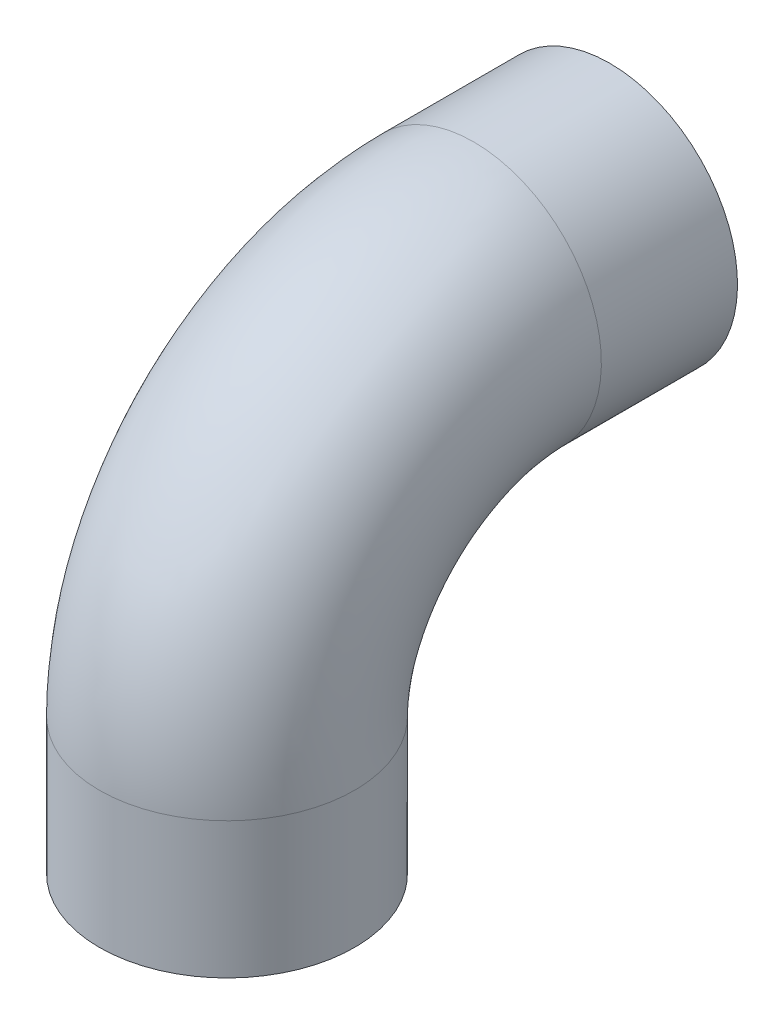
ISO-10303-21;
HEADER;
FILE_DESCRIPTION(('STEP AP214'),'2;1');
FILE_NAME('part.step','',(''),(''),'','','');
FILE_SCHEMA(('AUTOMOTIVE_DESIGN { 1 0 10303 214 1 1 1 1 }'));
ENDSEC;
DATA;
#1=APPLICATION_CONTEXT('core data for automotive mechanical design processes');
#2=APPLICATION_PROTOCOL_DEFINITION('international standard','automotive_design',2000,#1);
#3=PRODUCT_CONTEXT('',#1,'mechanical');
#4=PRODUCT('Part','Part','',(#3));
#5=PRODUCT_RELATED_PRODUCT_CATEGORY('part','',(#4));
#6=PRODUCT_DEFINITION_FORMATION('','',#4);
#7=PRODUCT_DEFINITION_CONTEXT('part definition',#1,'design');
#8=PRODUCT_DEFINITION('design','',#6,#7);
#9=PRODUCT_DEFINITION_SHAPE('','',#8);
#10=(LENGTH_UNIT() NAMED_UNIT(*) SI_UNIT(.MILLI.,.METRE.));
#11=(NAMED_UNIT(*) PLANE_ANGLE_UNIT() SI_UNIT($,.RADIAN.));
#12=(NAMED_UNIT(*) SI_UNIT($,.STERADIAN.) SOLID_ANGLE_UNIT());
#13=UNCERTAINTY_MEASURE_WITH_UNIT(LENGTH_MEASURE(1.E-05),#10,'distance_accuracy_value','');
#14=(GEOMETRIC_REPRESENTATION_CONTEXT(3) GLOBAL_UNCERTAINTY_ASSIGNED_CONTEXT((#13)) GLOBAL_UNIT_ASSIGNED_CONTEXT((#10,
#11,#12)) REPRESENTATION_CONTEXT('',''));
#15=CARTESIAN_POINT('',(0.,0.,0.));
#16=DIRECTION('',(0.,0.,1.));
#17=DIRECTION('',(1.,0.,0.));
#18=AXIS2_PLACEMENT_3D('',#15,#16,#17);
#19=CARTESIAN_POINT('',(0.,0.,0.));
#20=DIRECTION('',(0.,1.,0.));
#21=DIRECTION('',(0.,0.,1.));
#22=AXIS2_PLACEMENT_3D('',#19,#20,#21);
#23=CYLINDRICAL_SURFACE('',#22,14.2875);
#24=CARTESIAN_POINT('',(0.,15.24,0.));
#25=DIRECTION('',(0.,1.,0.));
#26=DIRECTION('',(0.,0.,1.));
#27=AXIS2_PLACEMENT_3D('',#24,#25,#26);
#28=CIRCLE('',#27,14.2875);
#29=CARTESIAN_POINT('',(0.,15.24,14.2875));
#30=VERTEX_POINT('',#29);
#31=EDGE_CURVE('E79',#30,#30,#28,.T.);
#32=ORIENTED_EDGE('',*,*,#31,.F.);
#33=EDGE_LOOP('',(#32));
#34=FACE_BOUND('',#33,.T.);
#35=CARTESIAN_POINT('',(0.,0.,0.));
#36=DIRECTION('',(0.,1.,0.));
#37=DIRECTION('',(0.,0.,1.));
#38=AXIS2_PLACEMENT_3D('',#35,#36,#37);
#39=CIRCLE('',#38,14.2875);
#40=CARTESIAN_POINT('',(0.,0.,14.2875));
#41=VERTEX_POINT('',#40);
#42=EDGE_CURVE('E48',#41,#41,#39,.T.);
#43=ORIENTED_EDGE('',*,*,#42,.T.);
#44=EDGE_LOOP('',(#43));
#45=FACE_BOUND('',#44,.T.);
#46=ADVANCED_FACE('F33',(#34,#45),#23,.T.);
#47=CARTESIAN_POINT('',(0.,15.24,-27.6225));
#48=DIRECTION('',(-1.,0.,0.));
#49=DIRECTION('',(0.,0.,1.));
#50=AXIS2_PLACEMENT_3D('',#47,#48,#49);
#51=TOROIDAL_SURFACE('',#50,27.6225,14.2875);
#52=CARTESIAN_POINT('',(0.,42.8625,-27.6225));
#53=DIRECTION('',(0.,0.,-1.));
#54=DIRECTION('',(0.,1.,0.));
#55=AXIS2_PLACEMENT_3D('',#52,#53,#54);
#56=CIRCLE('',#55,14.2875);
#57=CARTESIAN_POINT('',(0.,57.15,-27.6225));
#58=VERTEX_POINT('',#57);
#59=EDGE_CURVE('E37',#58,#58,#56,.T.);
#60=CARTESIAN_POINT('',(0.,15.24,-27.6225));
#61=DIRECTION('',(-1.,0.,0.));
#62=DIRECTION('',(0.,0.,1.));
#63=AXIS2_PLACEMENT_3D('',#60,#61,#62);
#64=CIRCLE('',#63,41.91);
#65=EDGE_CURVE('',#30,#58,#64,.T.);
#66=ORIENTED_EDGE('',*,*,#31,.T.);
#67=ORIENTED_EDGE('',*,*,#59,.F.);
#68=ORIENTED_EDGE('',*,*,#65,.T.);
#69=ORIENTED_EDGE('',*,*,#65,.F.);
#70=EDGE_LOOP('',(#66,#68,#67,#69));
#71=FACE_BOUND('',#70,.T.);
#72=ADVANCED_FACE('F87',(#71),#51,.T.);
#73=CARTESIAN_POINT('',(0.,42.8625,-27.6225));
#74=DIRECTION('',(0.,0.,-1.));
#75=DIRECTION('',(-1.,0.,0.));
#76=AXIS2_PLACEMENT_3D('',#73,#74,#75);
#77=CYLINDRICAL_SURFACE('',#76,14.2875);
#78=CARTESIAN_POINT('',(0.,42.8625,-42.8625));
#79=DIRECTION('',(0.,0.,-1.));
#80=DIRECTION('',(0.,1.,0.));
#81=AXIS2_PLACEMENT_3D('',#78,#79,#80);
#82=CIRCLE('',#81,14.2875);
#83=CARTESIAN_POINT('',(0.,57.15,-42.8625));
#84=VERTEX_POINT('',#83);
#85=EDGE_CURVE('E53',#84,#84,#82,.T.);
#86=ORIENTED_EDGE('',*,*,#85,.F.);
#87=EDGE_LOOP('',(#86));
#88=FACE_BOUND('',#87,.T.);
#89=ORIENTED_EDGE('',*,*,#59,.T.);
#90=EDGE_LOOP('',(#89));
#91=FACE_BOUND('',#90,.T.);
#92=ADVANCED_FACE('F35',(#88,#91),#77,.T.);
#93=CARTESIAN_POINT('',(0.,0.,0.));
#94=DIRECTION('',(0.,1.,0.));
#95=DIRECTION('',(0.,0.,1.));
#96=AXIS2_PLACEMENT_3D('',#93,#94,#95);
#97=PLANE('',#96);
#98=CARTESIAN_POINT('',(0.,0.,0.));
#99=DIRECTION('',(0.,1.,0.));
#100=DIRECTION('',(0.,0.,1.));
#101=AXIS2_PLACEMENT_3D('',#98,#99,#100);
#102=CIRCLE('',#101,10.668);
#103=CARTESIAN_POINT('',(0.,0.,10.668));
#104=VERTEX_POINT('',#103);
#105=EDGE_CURVE('E74',#104,#104,#102,.F.);
#106=ORIENTED_EDGE('',*,*,#105,.F.);
#107=EDGE_LOOP('',(#106));
#108=FACE_BOUND('',#107,.T.);
#109=ORIENTED_EDGE('',*,*,#42,.F.);
#110=EDGE_LOOP('',(#109));
#111=FACE_BOUND('',#110,.T.);
#112=ADVANCED_FACE('F93',(#108,#111),#97,.F.);
#113=CARTESIAN_POINT('',(0.,42.8625,-42.8625));
#114=DIRECTION('',(0.,0.,-1.));
#115=DIRECTION('',(0.,1.,0.));
#116=AXIS2_PLACEMENT_3D('',#113,#114,#115);
#117=PLANE('',#116);
#118=CARTESIAN_POINT('',(0.,42.8625,-42.8625));
#119=DIRECTION('',(0.,0.,-1.));
#120=DIRECTION('',(0.,1.,0.));
#121=AXIS2_PLACEMENT_3D('',#118,#119,#120);
#122=CIRCLE('',#121,10.668);
#123=CARTESIAN_POINT('',(0.,53.5305,-42.8625));
#124=VERTEX_POINT('',#123);
#125=EDGE_CURVE('E11',#124,#124,#122,.F.);
#126=ORIENTED_EDGE('',*,*,#125,.T.);
#127=EDGE_LOOP('',(#126));
#128=FACE_BOUND('',#127,.T.);
#129=ORIENTED_EDGE('',*,*,#85,.T.);
#130=EDGE_LOOP('',(#129));
#131=FACE_BOUND('',#130,.T.);
#132=ADVANCED_FACE('F60',(#128,#131),#117,.T.);
#133=CARTESIAN_POINT('',(0.,0.,0.));
#134=DIRECTION('',(0.,1.,0.));
#135=DIRECTION('',(0.,0.,1.));
#136=AXIS2_PLACEMENT_3D('',#133,#134,#135);
#137=CYLINDRICAL_SURFACE('',#136,10.668);
#138=CARTESIAN_POINT('',(0.,15.24,0.));
#139=DIRECTION('',(0.,1.,0.));
#140=DIRECTION('',(0.,0.,1.));
#141=AXIS2_PLACEMENT_3D('',#138,#139,#140);
#142=CIRCLE('',#141,10.668);
#143=CARTESIAN_POINT('',(0.,15.24,10.668));
#144=VERTEX_POINT('',#143);
#145=EDGE_CURVE('E71',#144,#144,#142,.F.);
#146=ORIENTED_EDGE('',*,*,#145,.F.);
#147=EDGE_LOOP('',(#146));
#148=FACE_BOUND('',#147,.T.);
#149=ORIENTED_EDGE('',*,*,#105,.T.);
#150=EDGE_LOOP('',(#149));
#151=FACE_BOUND('',#150,.T.);
#152=ADVANCED_FACE('F101',(#148,#151),#137,.F.);
#153=CARTESIAN_POINT('',(0.,15.24,-27.6225));
#154=DIRECTION('',(-1.,0.,0.));
#155=DIRECTION('',(0.,0.,1.));
#156=AXIS2_PLACEMENT_3D('',#153,#154,#155);
#157=TOROIDAL_SURFACE('',#156,27.6225,10.668);
#158=CARTESIAN_POINT('',(0.,42.8625,-27.6225));
#159=DIRECTION('',(0.,0.,-1.));
#160=DIRECTION('',(0.,1.,0.));
#161=AXIS2_PLACEMENT_3D('',#158,#159,#160);
#162=CIRCLE('',#161,10.668);
#163=CARTESIAN_POINT('',(0.,53.5305,-27.6225));
#164=VERTEX_POINT('',#163);
#165=EDGE_CURVE('E42',#164,#164,#162,.F.);
#166=CARTESIAN_POINT('',(0.,15.24,-27.6225));
#167=DIRECTION('',(-1.,0.,0.));
#168=DIRECTION('',(0.,0.,1.));
#169=AXIS2_PLACEMENT_3D('',#166,#167,#168);
#170=CIRCLE('',#169,38.2905);
#171=EDGE_CURVE('',#144,#164,#170,.T.);
#172=ORIENTED_EDGE('',*,*,#145,.T.);
#173=ORIENTED_EDGE('',*,*,#165,.F.);
#174=ORIENTED_EDGE('',*,*,#171,.T.);
#175=ORIENTED_EDGE('',*,*,#171,.F.);
#176=EDGE_LOOP('',(#172,#174,#173,#175));
#177=FACE_BOUND('',#176,.T.);
#178=ADVANCED_FACE('F66',(#177),#157,.F.);
#179=CARTESIAN_POINT('',(0.,42.8625,-27.6225));
#180=DIRECTION('',(0.,0.,-1.));
#181=DIRECTION('',(-1.,0.,0.));
#182=AXIS2_PLACEMENT_3D('',#179,#180,#181);
#183=CYLINDRICAL_SURFACE('',#182,10.668);
#184=ORIENTED_EDGE('',*,*,#125,.F.);
#185=EDGE_LOOP('',(#184));
#186=FACE_BOUND('',#185,.T.);
#187=ORIENTED_EDGE('',*,*,#165,.T.);
#188=EDGE_LOOP('',(#187));
#189=FACE_BOUND('',#188,.T.);
#190=ADVANCED_FACE('F63',(#186,#189),#183,.F.);
#191=CLOSED_SHELL('',(#46,#72,#92,#112,#132,#152,#178,#190));
#192=MANIFOLD_SOLID_BREP('B2',#191);
#193=ADVANCED_BREP_SHAPE_REPRESENTATION('',(#18,#192),#14);
#194=SHAPE_DEFINITION_REPRESENTATION(#9,#193);
ENDSEC;
END-ISO-10303-21;
